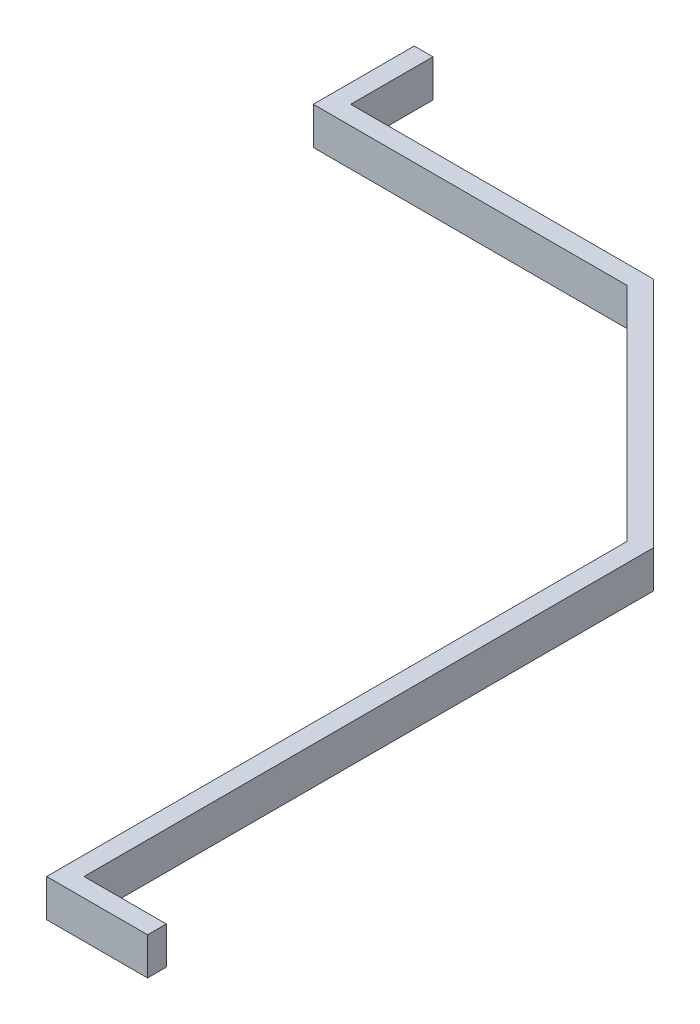
ISO-10303-21;
HEADER;
FILE_DESCRIPTION(('STEP AP214'),'2;1');
FILE_NAME('part.step','',(''),(''),'','','');
FILE_SCHEMA(('AUTOMOTIVE_DESIGN { 1 0 10303 214 1 1 1 1 }'));
ENDSEC;
DATA;
#1=APPLICATION_CONTEXT('core data for automotive mechanical design processes');
#2=APPLICATION_PROTOCOL_DEFINITION('international standard','automotive_design',2000,#1);
#3=PRODUCT_CONTEXT('',#1,'mechanical');
#4=PRODUCT('Part','Part','',(#3));
#5=PRODUCT_RELATED_PRODUCT_CATEGORY('part','',(#4));
#6=PRODUCT_DEFINITION_FORMATION('','',#4);
#7=PRODUCT_DEFINITION_CONTEXT('part definition',#1,'design');
#8=PRODUCT_DEFINITION('design','',#6,#7);
#9=PRODUCT_DEFINITION_SHAPE('','',#8);
#10=(LENGTH_UNIT() NAMED_UNIT(*) SI_UNIT(.MILLI.,.METRE.));
#11=(NAMED_UNIT(*) PLANE_ANGLE_UNIT() SI_UNIT($,.RADIAN.));
#12=(NAMED_UNIT(*) SI_UNIT($,.STERADIAN.) SOLID_ANGLE_UNIT());
#13=UNCERTAINTY_MEASURE_WITH_UNIT(LENGTH_MEASURE(1.E-05),#10,'distance_accuracy_value','');
#14=(GEOMETRIC_REPRESENTATION_CONTEXT(3) GLOBAL_UNCERTAINTY_ASSIGNED_CONTEXT((#13)) GLOBAL_UNIT_ASSIGNED_CONTEXT((#10,
#11,#12)) REPRESENTATION_CONTEXT('',''));
#15=CARTESIAN_POINT('',(0.,0.,0.));
#16=DIRECTION('',(0.,0.,1.));
#17=DIRECTION('',(1.,0.,0.));
#18=AXIS2_PLACEMENT_3D('',#15,#16,#17);
#19=CARTESIAN_POINT('',(-726.739860661157,50.8,-1088.68986066117));
#20=DIRECTION('',(-1.,0.,0.));
#21=DIRECTION('',(0.,0.,1.));
#22=AXIS2_PLACEMENT_3D('',#19,#20,#21);
#23=PLANE('',#22);
#24=DIRECTION('',(0.,0.,-1.));
#25=VECTOR('',#24,1.);
#26=CARTESIAN_POINT('',(-726.739860661157,0.,-1088.68986066117));
#27=LINE('',#26,#25);
#28=CARTESIAN_POINT('',(-726.739860661157,0.,-1088.68986066117));
#29=VERTEX_POINT('',#28);
#30=CARTESIAN_POINT('',(-726.739860661157,0.,-1200.28986066117));
#31=VERTEX_POINT('',#30);
#32=EDGE_CURVE('E164',#29,#31,#27,.T.);
#33=ORIENTED_EDGE('',*,*,#32,.T.);
#34=DIRECTION('',(0.,-1.,0.));
#35=VECTOR('',#34,1.);
#36=CARTESIAN_POINT('',(-726.739860661157,50.8,-1200.28986066117));
#37=LINE('',#36,#35);
#38=CARTESIAN_POINT('',(-726.739860661157,50.8,-1200.28986066117));
#39=VERTEX_POINT('',#38);
#40=EDGE_CURVE('E11',#39,#31,#37,.T.);
#41=ORIENTED_EDGE('',*,*,#40,.F.);
#42=DIRECTION('',(0.,0.,-1.));
#43=VECTOR('',#42,1.);
#44=CARTESIAN_POINT('',(-726.739860661157,50.8,-1088.68986066117));
#45=LINE('',#44,#43);
#46=CARTESIAN_POINT('',(-726.739860661157,50.8,-1088.68986066117));
#47=VERTEX_POINT('',#46);
#48=EDGE_CURVE('E198',#47,#39,#45,.T.);
#49=ORIENTED_EDGE('',*,*,#48,.F.);
#50=DIRECTION('',(0.,-1.,0.));
#51=VECTOR('',#50,1.);
#52=CARTESIAN_POINT('',(-726.739860661157,50.8,-1088.68986066117));
#53=LINE('',#52,#51);
#54=EDGE_CURVE('E160',#47,#29,#53,.T.);
#55=ORIENTED_EDGE('',*,*,#54,.T.);
#56=EDGE_LOOP('',(#33,#41,#49,#55));
#57=FACE_BOUND('',#56,.T.);
#58=ADVANCED_FACE('F39',(#57),#23,.F.);
#59=CARTESIAN_POINT('',(-726.739860661157,50.8,-1200.28986066117));
#60=DIRECTION('',(0.,0.,1.));
#61=DIRECTION('',(1.,0.,0.));
#62=AXIS2_PLACEMENT_3D('',#59,#60,#61);
#63=PLANE('',#62);
#64=DIRECTION('',(-1.,0.,0.));
#65=VECTOR('',#64,1.);
#66=CARTESIAN_POINT('',(-726.739860661157,0.,-1200.28986066117));
#67=LINE('',#66,#65);
#68=CARTESIAN_POINT('',(-752.139860661156,0.,-1200.28986066117));
#69=VERTEX_POINT('',#68);
#70=EDGE_CURVE('E168',#31,#69,#67,.T.);
#71=ORIENTED_EDGE('',*,*,#70,.T.);
#72=DIRECTION('',(0.,-1.,0.));
#73=VECTOR('',#72,1.);
#74=CARTESIAN_POINT('',(-752.139860661156,50.8,-1200.28986066117));
#75=LINE('',#74,#73);
#76=CARTESIAN_POINT('',(-752.139860661156,50.8,-1200.28986066117));
#77=VERTEX_POINT('',#76);
#78=EDGE_CURVE('E48',#77,#69,#75,.T.);
#79=ORIENTED_EDGE('',*,*,#78,.F.);
#80=DIRECTION('',(-1.,0.,0.));
#81=VECTOR('',#80,1.);
#82=CARTESIAN_POINT('',(-726.739860661157,50.8,-1200.28986066117));
#83=LINE('',#82,#81);
#84=EDGE_CURVE('E111',#39,#77,#83,.T.);
#85=ORIENTED_EDGE('',*,*,#84,.F.);
#86=ORIENTED_EDGE('',*,*,#40,.T.);
#87=EDGE_LOOP('',(#71,#79,#85,#86));
#88=FACE_BOUND('',#87,.T.);
#89=ADVANCED_FACE('F292',(#88),#63,.F.);
#90=CARTESIAN_POINT('',(-752.139860661156,50.8,-1200.28986066117));
#91=DIRECTION('',(1.,0.,0.));
#92=DIRECTION('',(0.,0.,-1.));
#93=AXIS2_PLACEMENT_3D('',#90,#91,#92);
#94=PLANE('',#93);
#95=DIRECTION('',(0.,0.,1.));
#96=VECTOR('',#95,1.);
#97=CARTESIAN_POINT('',(-752.139860661156,0.,-1200.28986066117));
#98=LINE('',#97,#96);
#99=CARTESIAN_POINT('',(-752.139860661156,0.,-1063.28986066117));
#100=VERTEX_POINT('',#99);
#101=EDGE_CURVE('E171',#69,#100,#98,.T.);
#102=ORIENTED_EDGE('',*,*,#101,.T.);
#103=DIRECTION('',(0.,-1.,0.));
#104=VECTOR('',#103,1.);
#105=CARTESIAN_POINT('',(-752.139860661156,50.8,-1063.28986066117));
#106=LINE('',#105,#104);
#107=CARTESIAN_POINT('',(-752.139860661156,50.8,-1063.28986066117));
#108=VERTEX_POINT('',#107);
#109=EDGE_CURVE('E225',#108,#100,#106,.T.);
#110=ORIENTED_EDGE('',*,*,#109,.F.);
#111=DIRECTION('',(0.,0.,1.));
#112=VECTOR('',#111,1.);
#113=CARTESIAN_POINT('',(-752.139860661156,50.8,-1200.28986066117));
#114=LINE('',#113,#112);
#115=EDGE_CURVE('E235',#77,#108,#114,.T.);
#116=ORIENTED_EDGE('',*,*,#115,.F.);
#117=ORIENTED_EDGE('',*,*,#78,.T.);
#118=EDGE_LOOP('',(#102,#110,#116,#117));
#119=FACE_BOUND('',#118,.T.);
#120=ADVANCED_FACE('F233',(#119),#94,.F.);
#121=CARTESIAN_POINT('',(-752.139860661156,50.8,-1063.28986066117));
#122=DIRECTION('',(0.,0.,-1.));
#123=DIRECTION('',(-1.,0.,0.));
#124=AXIS2_PLACEMENT_3D('',#121,#122,#123);
#125=PLANE('',#124);
#126=DIRECTION('',(1.,0.,0.));
#127=VECTOR('',#126,1.);
#128=CARTESIAN_POINT('',(-752.139860661156,0.,-1063.28986066117));
#129=LINE('',#128,#127);
#130=CARTESIAN_POINT('',(-326.502934113987,0.,-1063.28986066117));
#131=VERTEX_POINT('',#130);
#132=EDGE_CURVE('E174',#100,#131,#129,.T.);
#133=ORIENTED_EDGE('',*,*,#132,.T.);
#134=DIRECTION('',(0.,-1.,0.));
#135=VECTOR('',#134,1.);
#136=CARTESIAN_POINT('',(-326.502934113987,50.8,-1063.28986066117));
#137=LINE('',#136,#135);
#138=CARTESIAN_POINT('',(-326.502934113987,50.8,-1063.28986066117));
#139=VERTEX_POINT('',#138);
#140=EDGE_CURVE('E221',#139,#131,#137,.T.);
#141=ORIENTED_EDGE('',*,*,#140,.F.);
#142=DIRECTION('',(1.,0.,0.));
#143=VECTOR('',#142,1.);
#144=CARTESIAN_POINT('',(-752.139860661156,50.8,-1063.28986066117));
#145=LINE('',#144,#143);
#146=EDGE_CURVE('E254',#108,#139,#145,.T.);
#147=ORIENTED_EDGE('',*,*,#146,.F.);
#148=ORIENTED_EDGE('',*,*,#109,.T.);
#149=EDGE_LOOP('',(#133,#141,#147,#148));
#150=FACE_BOUND('',#149,.T.);
#151=ADVANCED_FACE('F244',(#150),#125,.F.);
#152=CARTESIAN_POINT('',(-326.502934113987,50.8,-1063.28986066117));
#153=DIRECTION('',(0.707106781186558,0.,-0.707106781186536));
#154=DIRECTION('',(-0.707106781186536,0.,-0.707106781186559));
#155=AXIS2_PLACEMENT_3D('',#152,#153,#154);
#156=PLANE('',#155);
#157=DIRECTION('',(0.707106781186536,0.,0.707106781186559));
#158=VECTOR('',#157,1.);
#159=CARTESIAN_POINT('',(-326.502934113987,0.,-1063.28986066117));
#160=LINE('',#159,#158);
#161=CARTESIAN_POINT('',(-25.4,0.,-762.186926547171));
#162=VERTEX_POINT('',#161);
#163=EDGE_CURVE('E177',#131,#162,#160,.T.);
#164=ORIENTED_EDGE('',*,*,#163,.T.);
#165=DIRECTION('',(0.,-1.,0.));
#166=VECTOR('',#165,1.);
#167=CARTESIAN_POINT('',(-25.4,50.8,-762.186926547171));
#168=LINE('',#167,#166);
#169=CARTESIAN_POINT('',(-25.4,50.8,-762.186926547171));
#170=VERTEX_POINT('',#169);
#171=EDGE_CURVE('E217',#170,#162,#168,.T.);
#172=ORIENTED_EDGE('',*,*,#171,.F.);
#173=DIRECTION('',(0.707106781186536,0.,0.707106781186559));
#174=VECTOR('',#173,1.);
#175=CARTESIAN_POINT('',(-326.502934113987,50.8,-1063.28986066117));
#176=LINE('',#175,#174);
#177=EDGE_CURVE('E250',#139,#170,#176,.T.);
#178=ORIENTED_EDGE('',*,*,#177,.F.);
#179=ORIENTED_EDGE('',*,*,#140,.T.);
#180=EDGE_LOOP('',(#164,#172,#178,#179));
#181=FACE_BOUND('',#180,.T.);
#182=ADVANCED_FACE('F248',(#181),#156,.F.);
#183=CARTESIAN_POINT('',(-25.4,50.8,-762.186926547171));
#184=DIRECTION('',(1.,0.,0.));
#185=DIRECTION('',(0.,0.,-1.));
#186=AXIS2_PLACEMENT_3D('',#183,#184,#185);
#187=PLANE('',#186);
#188=DIRECTION('',(0.,0.,1.));
#189=VECTOR('',#188,1.);
#190=CARTESIAN_POINT('',(-25.4,0.,-762.186926547171));
#191=LINE('',#190,#189);
#192=CARTESIAN_POINT('',(-25.3999999999999,0.,25.3999999999998));
#193=VERTEX_POINT('',#192);
#194=EDGE_CURVE('E180',#162,#193,#191,.T.);
#195=ORIENTED_EDGE('',*,*,#194,.T.);
#196=DIRECTION('',(0.,-1.,0.));
#197=VECTOR('',#196,1.);
#198=CARTESIAN_POINT('',(-25.3999999999999,50.8,25.3999999999998));
#199=LINE('',#198,#197);
#200=CARTESIAN_POINT('',(-25.3999999999999,50.8,25.3999999999998));
#201=VERTEX_POINT('',#200);
#202=EDGE_CURVE('E213',#201,#193,#199,.T.);
#203=ORIENTED_EDGE('',*,*,#202,.F.);
#204=DIRECTION('',(0.,0.,1.));
#205=VECTOR('',#204,1.);
#206=CARTESIAN_POINT('',(-25.4,50.8,-762.186926547171));
#207=LINE('',#206,#205);
#208=EDGE_CURVE('E253',#170,#201,#207,.T.);
#209=ORIENTED_EDGE('',*,*,#208,.F.);
#210=ORIENTED_EDGE('',*,*,#171,.T.);
#211=EDGE_LOOP('',(#195,#203,#209,#210));
#212=FACE_BOUND('',#211,.T.);
#213=ADVANCED_FACE('F305',(#212),#187,.F.);
#214=CARTESIAN_POINT('',(-25.3999999999999,50.8,25.3999999999998));
#215=DIRECTION('',(0.,0.,-1.));
#216=DIRECTION('',(-1.,0.,0.));
#217=AXIS2_PLACEMENT_3D('',#214,#215,#216);
#218=PLANE('',#217);
#219=DIRECTION('',(1.,0.,0.));
#220=VECTOR('',#219,1.);
#221=CARTESIAN_POINT('',(-25.3999999999999,0.,25.3999999999998));
#222=LINE('',#221,#220);
#223=CARTESIAN_POINT('',(111.600000000001,0.,25.3999999999998));
#224=VERTEX_POINT('',#223);
#225=EDGE_CURVE('E183',#193,#224,#222,.T.);
#226=ORIENTED_EDGE('',*,*,#225,.T.);
#227=DIRECTION('',(0.,-1.,0.));
#228=VECTOR('',#227,1.);
#229=CARTESIAN_POINT('',(111.600000000001,50.8,25.3999999999998));
#230=LINE('',#229,#228);
#231=CARTESIAN_POINT('',(111.600000000001,50.8,25.3999999999998));
#232=VERTEX_POINT('',#231);
#233=EDGE_CURVE('E209',#232,#224,#230,.T.);
#234=ORIENTED_EDGE('',*,*,#233,.F.);
#235=DIRECTION('',(1.,0.,0.));
#236=VECTOR('',#235,1.);
#237=CARTESIAN_POINT('',(-25.3999999999999,50.8,25.3999999999998));
#238=LINE('',#237,#236);
#239=EDGE_CURVE('E258',#201,#232,#238,.T.);
#240=ORIENTED_EDGE('',*,*,#239,.F.);
#241=ORIENTED_EDGE('',*,*,#202,.T.);
#242=EDGE_LOOP('',(#226,#234,#240,#241));
#243=FACE_BOUND('',#242,.T.);
#244=ADVANCED_FACE('F308',(#243),#218,.F.);
#245=CARTESIAN_POINT('',(111.600000000001,50.8,25.3999999999998));
#246=DIRECTION('',(-1.,0.,0.));
#247=DIRECTION('',(0.,0.,1.));
#248=AXIS2_PLACEMENT_3D('',#245,#246,#247);
#249=PLANE('',#248);
#250=DIRECTION('',(0.,0.,-1.));
#251=VECTOR('',#250,1.);
#252=CARTESIAN_POINT('',(111.600000000001,0.,25.3999999999998));
#253=LINE('',#252,#251);
#254=CARTESIAN_POINT('',(111.600000000001,0.,0.));
#255=VERTEX_POINT('',#254);
#256=EDGE_CURVE('E186',#224,#255,#253,.T.);
#257=ORIENTED_EDGE('',*,*,#256,.T.);
#258=DIRECTION('',(0.,-1.,0.));
#259=VECTOR('',#258,1.);
#260=CARTESIAN_POINT('',(111.600000000001,50.8,0.));
#261=LINE('',#260,#259);
#262=CARTESIAN_POINT('',(111.600000000001,50.8,0.));
#263=VERTEX_POINT('',#262);
#264=EDGE_CURVE('E205',#263,#255,#261,.T.);
#265=ORIENTED_EDGE('',*,*,#264,.F.);
#266=DIRECTION('',(0.,0.,-1.));
#267=VECTOR('',#266,1.);
#268=CARTESIAN_POINT('',(111.600000000001,50.8,25.3999999999998));
#269=LINE('',#268,#267);
#270=EDGE_CURVE('E265',#232,#263,#269,.T.);
#271=ORIENTED_EDGE('',*,*,#270,.F.);
#272=ORIENTED_EDGE('',*,*,#233,.T.);
#273=EDGE_LOOP('',(#257,#265,#271,#272));
#274=FACE_BOUND('',#273,.T.);
#275=ADVANCED_FACE('F273',(#274),#249,.F.);
#276=CARTESIAN_POINT('',(111.600000000001,50.8,0.));
#277=DIRECTION('',(0.,0.,1.));
#278=DIRECTION('',(1.,0.,0.));
#279=AXIS2_PLACEMENT_3D('',#276,#277,#278);
#280=PLANE('',#279);
#281=DIRECTION('',(-1.,0.,0.));
#282=VECTOR('',#281,1.);
#283=CARTESIAN_POINT('',(111.600000000001,0.,0.));
#284=LINE('',#283,#282);
#285=CARTESIAN_POINT('',(0.,0.,0.));
#286=VERTEX_POINT('',#285);
#287=EDGE_CURVE('E189',#255,#286,#284,.T.);
#288=ORIENTED_EDGE('',*,*,#287,.T.);
#289=DIRECTION('',(0.,-1.,0.));
#290=VECTOR('',#289,1.);
#291=CARTESIAN_POINT('',(0.,50.8,0.));
#292=LINE('',#291,#290);
#293=CARTESIAN_POINT('',(0.,50.8,0.));
#294=VERTEX_POINT('',#293);
#295=EDGE_CURVE('E153',#294,#286,#292,.T.);
#296=ORIENTED_EDGE('',*,*,#295,.F.);
#297=DIRECTION('',(-1.,0.,0.));
#298=VECTOR('',#297,1.);
#299=CARTESIAN_POINT('',(111.600000000001,50.8,0.));
#300=LINE('',#299,#298);
#301=EDGE_CURVE('E142',#263,#294,#300,.T.);
#302=ORIENTED_EDGE('',*,*,#301,.F.);
#303=ORIENTED_EDGE('',*,*,#264,.T.);
#304=EDGE_LOOP('',(#288,#296,#302,#303));
#305=FACE_BOUND('',#304,.T.);
#306=ADVANCED_FACE('F277',(#305),#280,.F.);
#307=CARTESIAN_POINT('',(0.,50.8,0.));
#308=DIRECTION('',(-1.,0.,0.));
#309=DIRECTION('',(0.,0.,1.));
#310=AXIS2_PLACEMENT_3D('',#307,#308,#309);
#311=PLANE('',#310);
#312=DIRECTION('',(0.,0.,-1.));
#313=VECTOR('',#312,1.);
#314=CARTESIAN_POINT('',(0.,0.,0.));
#315=LINE('',#314,#313);
#316=CARTESIAN_POINT('',(0.,0.,-772.707951031448));
#317=VERTEX_POINT('',#316);
#318=EDGE_CURVE('E151',#286,#317,#315,.T.);
#319=ORIENTED_EDGE('',*,*,#318,.T.);
#320=DIRECTION('',(0.,-1.,0.));
#321=VECTOR('',#320,1.);
#322=CARTESIAN_POINT('',(0.,50.8,-772.707951031448));
#323=LINE('',#322,#321);
#324=CARTESIAN_POINT('',(0.,50.8,-772.707951031448));
#325=VERTEX_POINT('',#324);
#326=EDGE_CURVE('E148',#325,#317,#323,.T.);
#327=ORIENTED_EDGE('',*,*,#326,.F.);
#328=DIRECTION('',(0.,0.,-1.));
#329=VECTOR('',#328,1.);
#330=CARTESIAN_POINT('',(0.,50.8,0.));
#331=LINE('',#330,#329);
#332=EDGE_CURVE('E136',#294,#325,#331,.T.);
#333=ORIENTED_EDGE('',*,*,#332,.F.);
#334=ORIENTED_EDGE('',*,*,#295,.T.);
#335=EDGE_LOOP('',(#319,#327,#333,#334));
#336=FACE_BOUND('',#335,.T.);
#337=ADVANCED_FACE('F149',(#336),#311,.F.);
#338=CARTESIAN_POINT('',(0.,50.8,-772.707951031448));
#339=DIRECTION('',(-0.707106781186558,0.,0.707106781186537));
#340=DIRECTION('',(0.707106781186537,0.,0.707106781186558));
#341=AXIS2_PLACEMENT_3D('',#338,#339,#340);
#342=PLANE('',#341);
#343=DIRECTION('',(-0.707106781186537,0.,-0.707106781186558));
#344=VECTOR('',#343,1.);
#345=CARTESIAN_POINT('',(0.,0.,-772.707951031448));
#346=LINE('',#345,#344);
#347=CARTESIAN_POINT('',(-315.98190962971,0.,-1088.68986066117));
#348=VERTEX_POINT('',#347);
#349=EDGE_CURVE('E97',#317,#348,#346,.T.);
#350=ORIENTED_EDGE('',*,*,#349,.T.);
#351=DIRECTION('',(0.,-1.,0.));
#352=VECTOR('',#351,1.);
#353=CARTESIAN_POINT('',(-315.98190962971,50.8,-1088.68986066117));
#354=LINE('',#353,#352);
#355=CARTESIAN_POINT('',(-315.98190962971,50.8,-1088.68986066117));
#356=VERTEX_POINT('',#355);
#357=EDGE_CURVE('E154',#356,#348,#354,.T.);
#358=ORIENTED_EDGE('',*,*,#357,.F.);
#359=DIRECTION('',(-0.707106781186537,0.,-0.707106781186558));
#360=VECTOR('',#359,1.);
#361=CARTESIAN_POINT('',(0.,50.8,-772.707951031448));
#362=LINE('',#361,#360);
#363=EDGE_CURVE('E140',#325,#356,#362,.T.);
#364=ORIENTED_EDGE('',*,*,#363,.F.);
#365=ORIENTED_EDGE('',*,*,#326,.T.);
#366=EDGE_LOOP('',(#350,#358,#364,#365));
#367=FACE_BOUND('',#366,.T.);
#368=ADVANCED_FACE('F156',(#367),#342,.F.);
#369=CARTESIAN_POINT('',(-315.98190962971,50.8,-1088.68986066117));
#370=DIRECTION('',(0.,0.,1.));
#371=DIRECTION('',(1.,0.,0.));
#372=AXIS2_PLACEMENT_3D('',#369,#370,#371);
#373=PLANE('',#372);
#374=DIRECTION('',(-1.,0.,0.));
#375=VECTOR('',#374,1.);
#376=CARTESIAN_POINT('',(-315.98190962971,0.,-1088.68986066117));
#377=LINE('',#376,#375);
#378=EDGE_CURVE('E103',#348,#29,#377,.T.);
#379=ORIENTED_EDGE('',*,*,#378,.T.);
#380=ORIENTED_EDGE('',*,*,#54,.F.);
#381=DIRECTION('',(-1.,0.,0.));
#382=VECTOR('',#381,1.);
#383=CARTESIAN_POINT('',(-315.98190962971,50.8,-1088.68986066117));
#384=LINE('',#383,#382);
#385=EDGE_CURVE('E56',#356,#47,#384,.T.);
#386=ORIENTED_EDGE('',*,*,#385,.F.);
#387=ORIENTED_EDGE('',*,*,#357,.T.);
#388=EDGE_LOOP('',(#379,#380,#386,#387));
#389=FACE_BOUND('',#388,.T.);
#390=ADVANCED_FACE('F281',(#389),#373,.F.);
#391=CARTESIAN_POINT('',(0.,50.8,0.));
#392=DIRECTION('',(0.,1.,0.));
#393=DIRECTION('',(0.,0.,1.));
#394=AXIS2_PLACEMENT_3D('',#391,#392,#393);
#395=PLANE('',#394);
#396=ORIENTED_EDGE('',*,*,#48,.T.);
#397=ORIENTED_EDGE('',*,*,#84,.T.);
#398=ORIENTED_EDGE('',*,*,#115,.T.);
#399=ORIENTED_EDGE('',*,*,#146,.T.);
#400=ORIENTED_EDGE('',*,*,#177,.T.);
#401=ORIENTED_EDGE('',*,*,#208,.T.);
#402=ORIENTED_EDGE('',*,*,#239,.T.);
#403=ORIENTED_EDGE('',*,*,#270,.T.);
#404=ORIENTED_EDGE('',*,*,#301,.T.);
#405=ORIENTED_EDGE('',*,*,#332,.T.);
#406=ORIENTED_EDGE('',*,*,#363,.T.);
#407=ORIENTED_EDGE('',*,*,#385,.T.);
#408=EDGE_LOOP('',(#396,#397,#398,#399,#400,#401,#402,#403,#404,#405,#406,#407));
#409=FACE_BOUND('',#408,.T.);
#410=ADVANCED_FACE('F138',(#409),#395,.T.);
#411=CARTESIAN_POINT('',(0.,0.,0.));
#412=DIRECTION('',(0.,1.,0.));
#413=DIRECTION('',(0.,0.,1.));
#414=AXIS2_PLACEMENT_3D('',#411,#412,#413);
#415=PLANE('',#414);
#416=ORIENTED_EDGE('',*,*,#32,.F.);
#417=ORIENTED_EDGE('',*,*,#378,.F.);
#418=ORIENTED_EDGE('',*,*,#349,.F.);
#419=ORIENTED_EDGE('',*,*,#318,.F.);
#420=ORIENTED_EDGE('',*,*,#287,.F.);
#421=ORIENTED_EDGE('',*,*,#256,.F.);
#422=ORIENTED_EDGE('',*,*,#225,.F.);
#423=ORIENTED_EDGE('',*,*,#194,.F.);
#424=ORIENTED_EDGE('',*,*,#163,.F.);
#425=ORIENTED_EDGE('',*,*,#132,.F.);
#426=ORIENTED_EDGE('',*,*,#101,.F.);
#427=ORIENTED_EDGE('',*,*,#70,.F.);
#428=EDGE_LOOP('',(#416,#417,#418,#419,#420,#421,#422,#423,#424,#425,#426,#427));
#429=FACE_BOUND('',#428,.T.);
#430=ADVANCED_FACE('F239',(#429),#415,.F.);
#431=CLOSED_SHELL('',(#58,#89,#120,#151,#182,#213,#244,#275,#306,#337,#368,#390,#410,#430));
#432=MANIFOLD_SOLID_BREP('B2',#431);
#433=ADVANCED_BREP_SHAPE_REPRESENTATION('',(#18,#432),#14);
#434=SHAPE_DEFINITION_REPRESENTATION(#9,#433);
ENDSEC;
END-ISO-10303-21;
